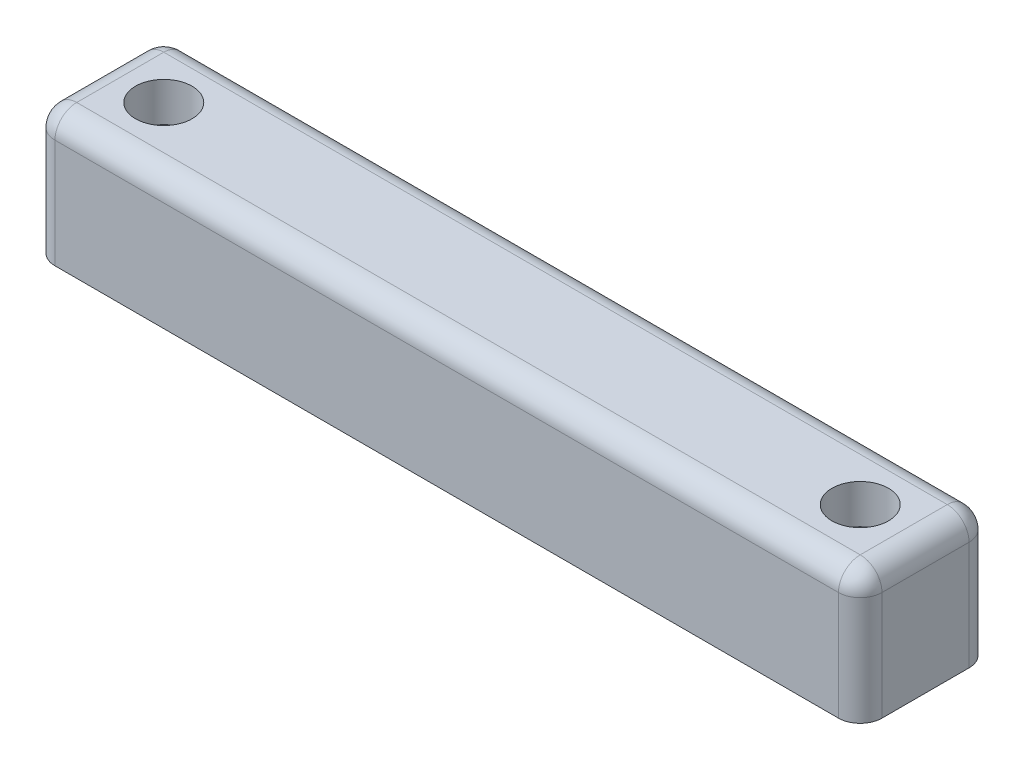
ISO-10303-21;
HEADER;
FILE_DESCRIPTION(('STEP AP214'),'2;1');
FILE_NAME('part.step','',(''),(''),'','','');
FILE_SCHEMA(('AUTOMOTIVE_DESIGN { 1 0 10303 214 1 1 1 1 }'));
ENDSEC;
DATA;
#1=APPLICATION_CONTEXT('core data for automotive mechanical design processes');
#2=APPLICATION_PROTOCOL_DEFINITION('international standard','automotive_design',2000,#1);
#3=PRODUCT_CONTEXT('',#1,'mechanical');
#4=PRODUCT('Part','Part','',(#3));
#5=PRODUCT_RELATED_PRODUCT_CATEGORY('part','',(#4));
#6=PRODUCT_DEFINITION_FORMATION('','',#4);
#7=PRODUCT_DEFINITION_CONTEXT('part definition',#1,'design');
#8=PRODUCT_DEFINITION('design','',#6,#7);
#9=PRODUCT_DEFINITION_SHAPE('','',#8);
#10=(LENGTH_UNIT() NAMED_UNIT(*) SI_UNIT(.MILLI.,.METRE.));
#11=(NAMED_UNIT(*) PLANE_ANGLE_UNIT() SI_UNIT($,.RADIAN.));
#12=(NAMED_UNIT(*) SI_UNIT($,.STERADIAN.) SOLID_ANGLE_UNIT());
#13=UNCERTAINTY_MEASURE_WITH_UNIT(LENGTH_MEASURE(1.E-05),#10,'distance_accuracy_value','');
#14=(GEOMETRIC_REPRESENTATION_CONTEXT(3) GLOBAL_UNCERTAINTY_ASSIGNED_CONTEXT((#13)) GLOBAL_UNIT_ASSIGNED_CONTEXT((#10,
#11,#12)) REPRESENTATION_CONTEXT('',''));
#15=CARTESIAN_POINT('',(0.,0.,0.));
#16=DIRECTION('',(0.,0.,1.));
#17=DIRECTION('',(1.,0.,0.));
#18=AXIS2_PLACEMENT_3D('',#15,#16,#17);
#19=CARTESIAN_POINT('',(-95.,-15.,15.));
#20=DIRECTION('',(1.,0.,0.));
#21=DIRECTION('',(0.,0.,-1.));
#22=AXIS2_PLACEMENT_3D('',#19,#20,#21);
#23=PLANE('',#22);
#24=DIRECTION('',(0.,0.,-1.));
#25=VECTOR('',#24,1.);
#26=CARTESIAN_POINT('',(-95.,9.99999999999999,15.));
#27=LINE('',#26,#25);
#28=CARTESIAN_POINT('',(-95.,9.99999999999999,10.));
#29=VERTEX_POINT('',#28);
#30=CARTESIAN_POINT('',(-95.,9.99999999999999,-10.));
#31=VERTEX_POINT('',#30);
#32=EDGE_CURVE('E213',#29,#31,#27,.T.);
#33=ORIENTED_EDGE('',*,*,#32,.T.);
#34=DIRECTION('',(0.,-1.,0.));
#35=VECTOR('',#34,1.);
#36=CARTESIAN_POINT('',(-95.,-15.,-10.));
#37=LINE('',#36,#35);
#38=CARTESIAN_POINT('',(-95.,-15.,-10.));
#39=VERTEX_POINT('',#38);
#40=EDGE_CURVE('E216',#31,#39,#37,.T.);
#41=ORIENTED_EDGE('',*,*,#40,.T.);
#42=DIRECTION('',(0.,0.,-1.));
#43=VECTOR('',#42,1.);
#44=CARTESIAN_POINT('',(-95.,-15.,15.));
#45=LINE('',#44,#43);
#46=CARTESIAN_POINT('',(-95.,-15.,10.));
#47=VERTEX_POINT('',#46);
#48=EDGE_CURVE('E179',#47,#39,#45,.T.);
#49=ORIENTED_EDGE('',*,*,#48,.F.);
#50=DIRECTION('',(0.,-1.,0.));
#51=VECTOR('',#50,1.);
#52=CARTESIAN_POINT('',(-95.,15.,10.));
#53=LINE('',#52,#51);
#54=EDGE_CURVE('E210',#47,#29,#53,.F.);
#55=ORIENTED_EDGE('',*,*,#54,.T.);
#56=EDGE_LOOP('',(#33,#41,#49,#55));
#57=FACE_BOUND('',#56,.T.);
#58=ADVANCED_FACE('F56',(#57),#23,.F.);
#59=CARTESIAN_POINT('',(95.,-15.,15.));
#60=DIRECTION('',(0.,1.,0.));
#61=DIRECTION('',(-1.,0.,0.));
#62=AXIS2_PLACEMENT_3D('',#59,#60,#61);
#63=PLANE('',#62);
#64=CARTESIAN_POINT('',(-80.,-15.,0.));
#65=DIRECTION('',(0.,1.,0.));
#66=DIRECTION('',(0.,0.,1.));
#67=AXIS2_PLACEMENT_3D('',#64,#65,#66);
#68=CIRCLE('',#67,3.3);
#69=CARTESIAN_POINT('',(-80.,-15.,3.3));
#70=VERTEX_POINT('',#69);
#71=EDGE_CURVE('E572',#70,#70,#68,.T.);
#72=ORIENTED_EDGE('',*,*,#71,.T.);
#73=EDGE_LOOP('',(#72));
#74=FACE_BOUND('',#73,.T.);
#75=CARTESIAN_POINT('',(80.,-15.,0.));
#76=DIRECTION('',(0.,1.,0.));
#77=DIRECTION('',(0.,0.,1.));
#78=AXIS2_PLACEMENT_3D('',#75,#76,#77);
#79=CIRCLE('',#78,3.3);
#80=CARTESIAN_POINT('',(80.,-15.,3.3));
#81=VERTEX_POINT('',#80);
#82=EDGE_CURVE('E158',#81,#81,#79,.T.);
#83=ORIENTED_EDGE('',*,*,#82,.T.);
#84=EDGE_LOOP('',(#83));
#85=FACE_BOUND('',#84,.T.);
#86=ORIENTED_EDGE('',*,*,#48,.T.);
#87=CARTESIAN_POINT('',(-90.,-15.,-10.));
#88=DIRECTION('',(0.,1.,0.));
#89=DIRECTION('',(-1.,0.,0.));
#90=AXIS2_PLACEMENT_3D('',#87,#88,#89);
#91=CIRCLE('',#90,5.);
#92=CARTESIAN_POINT('',(-90.,-15.,-15.));
#93=VERTEX_POINT('',#92);
#94=EDGE_CURVE('E13',#39,#93,#91,.F.);
#95=ORIENTED_EDGE('',*,*,#94,.T.);
#96=DIRECTION('',(1.,0.,0.));
#97=VECTOR('',#96,1.);
#98=CARTESIAN_POINT('',(95.,-15.,-15.));
#99=LINE('',#98,#97);
#100=CARTESIAN_POINT('',(90.,-15.,-15.));
#101=VERTEX_POINT('',#100);
#102=EDGE_CURVE('E265',#93,#101,#99,.T.);
#103=ORIENTED_EDGE('',*,*,#102,.T.);
#104=CARTESIAN_POINT('',(90.,-15.,-10.));
#105=DIRECTION('',(0.,1.,0.));
#106=DIRECTION('',(-1.,0.,0.));
#107=AXIS2_PLACEMENT_3D('',#104,#105,#106);
#108=CIRCLE('',#107,5.);
#109=CARTESIAN_POINT('',(95.,-15.,-10.));
#110=VERTEX_POINT('',#109);
#111=EDGE_CURVE('E229',#101,#110,#108,.F.);
#112=ORIENTED_EDGE('',*,*,#111,.T.);
#113=DIRECTION('',(0.,0.,-1.));
#114=VECTOR('',#113,1.);
#115=CARTESIAN_POINT('',(95.,-15.,15.));
#116=LINE('',#115,#114);
#117=CARTESIAN_POINT('',(95.,-15.,10.));
#118=VERTEX_POINT('',#117);
#119=EDGE_CURVE('E277',#118,#110,#116,.T.);
#120=ORIENTED_EDGE('',*,*,#119,.F.);
#121=CARTESIAN_POINT('',(90.,-15.,10.));
#122=DIRECTION('',(0.,1.,0.));
#123=DIRECTION('',(-1.,0.,0.));
#124=AXIS2_PLACEMENT_3D('',#121,#122,#123);
#125=CIRCLE('',#124,5.);
#126=CARTESIAN_POINT('',(90.,-15.,15.));
#127=VERTEX_POINT('',#126);
#128=EDGE_CURVE('E226',#118,#127,#125,.F.);
#129=ORIENTED_EDGE('',*,*,#128,.T.);
#130=DIRECTION('',(1.,0.,0.));
#131=VECTOR('',#130,1.);
#132=CARTESIAN_POINT('',(95.,-15.,15.));
#133=LINE('',#132,#131);
#134=CARTESIAN_POINT('',(-90.,-15.,15.));
#135=VERTEX_POINT('',#134);
#136=EDGE_CURVE('E270',#135,#127,#133,.T.);
#137=ORIENTED_EDGE('',*,*,#136,.F.);
#138=CARTESIAN_POINT('',(-90.,-15.,10.));
#139=DIRECTION('',(0.,1.,0.));
#140=DIRECTION('',(-1.,0.,0.));
#141=AXIS2_PLACEMENT_3D('',#138,#139,#140);
#142=CIRCLE('',#141,5.);
#143=EDGE_CURVE('E66',#135,#47,#142,.F.);
#144=ORIENTED_EDGE('',*,*,#143,.T.);
#145=EDGE_LOOP('',(#86,#95,#103,#112,#120,#129,#137,#144));
#146=FACE_BOUND('',#145,.T.);
#147=ADVANCED_FACE('F326',(#74,#85,#146),#63,.F.);
#148=CARTESIAN_POINT('',(95.,-15.,15.));
#149=DIRECTION('',(-1.,0.,0.));
#150=DIRECTION('',(0.,0.,1.));
#151=AXIS2_PLACEMENT_3D('',#148,#149,#150);
#152=PLANE('',#151);
#153=ORIENTED_EDGE('',*,*,#119,.T.);
#154=DIRECTION('',(0.,1.,0.));
#155=VECTOR('',#154,1.);
#156=CARTESIAN_POINT('',(95.,-15.,-10.));
#157=LINE('',#156,#155);
#158=CARTESIAN_POINT('',(95.,10.,-10.));
#159=VERTEX_POINT('',#158);
#160=EDGE_CURVE('E198',#110,#159,#157,.T.);
#161=ORIENTED_EDGE('',*,*,#160,.T.);
#162=DIRECTION('',(0.,0.,-1.));
#163=VECTOR('',#162,1.);
#164=CARTESIAN_POINT('',(95.,10.,15.));
#165=LINE('',#164,#163);
#166=CARTESIAN_POINT('',(95.,10.,10.));
#167=VERTEX_POINT('',#166);
#168=EDGE_CURVE('E153',#159,#167,#165,.F.);
#169=ORIENTED_EDGE('',*,*,#168,.T.);
#170=DIRECTION('',(0.,1.,0.));
#171=VECTOR('',#170,1.);
#172=CARTESIAN_POINT('',(95.,-15.,10.));
#173=LINE('',#172,#171);
#174=EDGE_CURVE('E186',#167,#118,#173,.F.);
#175=ORIENTED_EDGE('',*,*,#174,.T.);
#176=EDGE_LOOP('',(#153,#161,#169,#175));
#177=FACE_BOUND('',#176,.T.);
#178=ADVANCED_FACE('F306',(#177),#152,.F.);
#179=CARTESIAN_POINT('',(95.,15.,15.));
#180=DIRECTION('',(0.,-1.,0.));
#181=DIRECTION('',(1.,0.,0.));
#182=AXIS2_PLACEMENT_3D('',#179,#180,#181);
#183=PLANE('',#182);
#184=CARTESIAN_POINT('',(-80.,15.,0.));
#185=DIRECTION('',(0.,1.,0.));
#186=DIRECTION('',(0.,0.,1.));
#187=AXIS2_PLACEMENT_3D('',#184,#185,#186);
#188=CIRCLE('',#187,6.50000000000001);
#189=CARTESIAN_POINT('',(-80.,15.,6.50000000000001));
#190=VERTEX_POINT('',#189);
#191=EDGE_CURVE('E565',#190,#190,#188,.T.);
#192=ORIENTED_EDGE('',*,*,#191,.F.);
#193=EDGE_LOOP('',(#192));
#194=FACE_BOUND('',#193,.T.);
#195=CARTESIAN_POINT('',(80.,15.,0.));
#196=DIRECTION('',(0.,1.,0.));
#197=DIRECTION('',(0.,0.,1.));
#198=AXIS2_PLACEMENT_3D('',#195,#196,#197);
#199=CIRCLE('',#198,6.50000000000001);
#200=CARTESIAN_POINT('',(80.,15.,6.50000000000001));
#201=VERTEX_POINT('',#200);
#202=EDGE_CURVE('E568',#201,#201,#199,.T.);
#203=ORIENTED_EDGE('',*,*,#202,.F.);
#204=EDGE_LOOP('',(#203));
#205=FACE_BOUND('',#204,.T.);
#206=DIRECTION('',(-1.,0.,0.));
#207=VECTOR('',#206,1.);
#208=CARTESIAN_POINT('',(95.,15.,10.));
#209=LINE('',#208,#207);
#210=CARTESIAN_POINT('',(-90.,15.,10.));
#211=VERTEX_POINT('',#210);
#212=CARTESIAN_POINT('',(90.,15.,10.));
#213=VERTEX_POINT('',#212);
#214=EDGE_CURVE('E183',#211,#213,#209,.F.);
#215=ORIENTED_EDGE('',*,*,#214,.T.);
#216=DIRECTION('',(0.,0.,-1.));
#217=VECTOR('',#216,1.);
#218=CARTESIAN_POINT('',(90.,15.,15.));
#219=LINE('',#218,#217);
#220=CARTESIAN_POINT('',(90.,15.,-10.));
#221=VERTEX_POINT('',#220);
#222=EDGE_CURVE('E151',#213,#221,#219,.T.);
#223=ORIENTED_EDGE('',*,*,#222,.T.);
#224=DIRECTION('',(-1.,0.,0.));
#225=VECTOR('',#224,1.);
#226=CARTESIAN_POINT('',(95.,15.,-10.));
#227=LINE('',#226,#225);
#228=CARTESIAN_POINT('',(-90.,15.,-10.));
#229=VERTEX_POINT('',#228);
#230=EDGE_CURVE('E171',#221,#229,#227,.T.);
#231=ORIENTED_EDGE('',*,*,#230,.T.);
#232=DIRECTION('',(0.,0.,-1.));
#233=VECTOR('',#232,1.);
#234=CARTESIAN_POINT('',(-90.,15.,15.));
#235=LINE('',#234,#233);
#236=EDGE_CURVE('E178',#229,#211,#235,.F.);
#237=ORIENTED_EDGE('',*,*,#236,.T.);
#238=EDGE_LOOP('',(#215,#223,#231,#237));
#239=FACE_BOUND('',#238,.T.);
#240=ADVANCED_FACE('F181',(#194,#205,#239),#183,.F.);
#241=CARTESIAN_POINT('',(0.,0.,15.));
#242=DIRECTION('',(0.,0.,1.));
#243=DIRECTION('',(1.,0.,0.));
#244=AXIS2_PLACEMENT_3D('',#241,#242,#243);
#245=PLANE('',#244);
#246=DIRECTION('',(-1.,0.,0.));
#247=VECTOR('',#246,1.);
#248=CARTESIAN_POINT('',(-95.,9.99999999999998,15.));
#249=LINE('',#248,#247);
#250=CARTESIAN_POINT('',(90.,10.,15.));
#251=VERTEX_POINT('',#250);
#252=CARTESIAN_POINT('',(-90.,9.99999999999998,15.));
#253=VERTEX_POINT('',#252);
#254=EDGE_CURVE('E204',#251,#253,#249,.T.);
#255=ORIENTED_EDGE('',*,*,#254,.T.);
#256=DIRECTION('',(0.,-1.,0.));
#257=VECTOR('',#256,1.);
#258=CARTESIAN_POINT('',(-90.,-15.,15.));
#259=LINE('',#258,#257);
#260=EDGE_CURVE('E207',#253,#135,#259,.T.);
#261=ORIENTED_EDGE('',*,*,#260,.T.);
#262=ORIENTED_EDGE('',*,*,#136,.T.);
#263=DIRECTION('',(0.,1.,0.));
#264=VECTOR('',#263,1.);
#265=CARTESIAN_POINT('',(90.,15.,15.));
#266=LINE('',#265,#264);
#267=EDGE_CURVE('E201',#127,#251,#266,.T.);
#268=ORIENTED_EDGE('',*,*,#267,.T.);
#269=EDGE_LOOP('',(#255,#261,#262,#268));
#270=FACE_BOUND('',#269,.T.);
#271=ADVANCED_FACE('F440',(#270),#245,.T.);
#272=CARTESIAN_POINT('',(0.,0.,-15.));
#273=DIRECTION('',(0.,0.,1.));
#274=DIRECTION('',(1.,0.,0.));
#275=AXIS2_PLACEMENT_3D('',#272,#273,#274);
#276=PLANE('',#275);
#277=ORIENTED_EDGE('',*,*,#102,.F.);
#278=DIRECTION('',(0.,-1.,0.));
#279=VECTOR('',#278,1.);
#280=CARTESIAN_POINT('',(-90.,0.,-15.));
#281=LINE('',#280,#279);
#282=CARTESIAN_POINT('',(-90.,9.99999999999999,-15.));
#283=VERTEX_POINT('',#282);
#284=EDGE_CURVE('E74',#93,#283,#281,.F.);
#285=ORIENTED_EDGE('',*,*,#284,.T.);
#286=DIRECTION('',(-1.,0.,0.));
#287=VECTOR('',#286,1.);
#288=CARTESIAN_POINT('',(0.,10.,-15.));
#289=LINE('',#288,#287);
#290=CARTESIAN_POINT('',(90.,10.,-15.));
#291=VERTEX_POINT('',#290);
#292=EDGE_CURVE('E82',#283,#291,#289,.F.);
#293=ORIENTED_EDGE('',*,*,#292,.T.);
#294=DIRECTION('',(0.,1.,0.));
#295=VECTOR('',#294,1.);
#296=CARTESIAN_POINT('',(90.,0.,-15.));
#297=LINE('',#296,#295);
#298=EDGE_CURVE('E219',#291,#101,#297,.F.);
#299=ORIENTED_EDGE('',*,*,#298,.T.);
#300=EDGE_LOOP('',(#277,#285,#293,#299));
#301=FACE_BOUND('',#300,.T.);
#302=ADVANCED_FACE('F310',(#301),#276,.F.);
#303=CARTESIAN_POINT('',(-90.,0.,10.));
#304=DIRECTION('',(0.,1.,0.));
#305=DIRECTION('',(0.,0.,1.));
#306=AXIS2_PLACEMENT_3D('',#303,#304,#305);
#307=CYLINDRICAL_SURFACE('',#306,5.);
#308=ORIENTED_EDGE('',*,*,#143,.F.);
#309=ORIENTED_EDGE('',*,*,#260,.F.);
#310=CARTESIAN_POINT('',(-90.,9.99999999999999,10.));
#311=DIRECTION('',(0.,1.,0.));
#312=DIRECTION('',(0.,0.,1.));
#313=AXIS2_PLACEMENT_3D('',#310,#311,#312);
#314=CIRCLE('',#313,5.);
#315=EDGE_CURVE('E60',#29,#253,#314,.T.);
#316=ORIENTED_EDGE('',*,*,#315,.F.);
#317=ORIENTED_EDGE('',*,*,#54,.F.);
#318=EDGE_LOOP('',(#308,#309,#316,#317));
#319=FACE_BOUND('',#318,.T.);
#320=ADVANCED_FACE('F58',(#319),#307,.T.);
#321=CARTESIAN_POINT('',(-90.,9.99999999999999,15.));
#322=DIRECTION('',(0.,0.,-1.));
#323=DIRECTION('',(-1.,0.,0.));
#324=AXIS2_PLACEMENT_3D('',#321,#322,#323);
#325=CYLINDRICAL_SURFACE('',#324,5.);
#326=CARTESIAN_POINT('',(-90.,9.99999999999999,-10.));
#327=DIRECTION('',(0.,0.,-1.));
#328=DIRECTION('',(-1.,0.,0.));
#329=AXIS2_PLACEMENT_3D('',#326,#327,#328);
#330=CIRCLE('',#329,5.);
#331=EDGE_CURVE('E254',#31,#229,#330,.T.);
#332=ORIENTED_EDGE('',*,*,#331,.F.);
#333=ORIENTED_EDGE('',*,*,#32,.F.);
#334=CARTESIAN_POINT('',(-90.,9.99999999999999,10.));
#335=DIRECTION('',(0.,0.,1.));
#336=DIRECTION('',(1.,0.,0.));
#337=AXIS2_PLACEMENT_3D('',#334,#335,#336);
#338=CIRCLE('',#337,5.);
#339=EDGE_CURVE('E257',#211,#29,#338,.T.);
#340=ORIENTED_EDGE('',*,*,#339,.F.);
#341=ORIENTED_EDGE('',*,*,#236,.F.);
#342=EDGE_LOOP('',(#332,#333,#340,#341));
#343=FACE_BOUND('',#342,.T.);
#344=ADVANCED_FACE('F290',(#343),#325,.T.);
#345=CARTESIAN_POINT('',(-90.,-15.,-10.));
#346=DIRECTION('',(0.,-1.,0.));
#347=DIRECTION('',(0.,0.,-1.));
#348=AXIS2_PLACEMENT_3D('',#345,#346,#347);
#349=CYLINDRICAL_SURFACE('',#348,5.);
#350=ORIENTED_EDGE('',*,*,#94,.F.);
#351=ORIENTED_EDGE('',*,*,#40,.F.);
#352=CARTESIAN_POINT('',(-90.,9.99999999999999,-10.));
#353=DIRECTION('',(0.,1.,0.));
#354=DIRECTION('',(0.,0.,1.));
#355=AXIS2_PLACEMENT_3D('',#352,#353,#354);
#356=CIRCLE('',#355,5.);
#357=EDGE_CURVE('E250',#283,#31,#356,.T.);
#358=ORIENTED_EDGE('',*,*,#357,.F.);
#359=ORIENTED_EDGE('',*,*,#284,.F.);
#360=EDGE_LOOP('',(#350,#351,#358,#359));
#361=FACE_BOUND('',#360,.T.);
#362=ADVANCED_FACE('F313',(#361),#349,.T.);
#363=CARTESIAN_POINT('',(-90.,9.99999999999999,10.));
#364=DIRECTION('',(0.,0.,1.));
#365=DIRECTION('',(1.,0.,0.));
#366=AXIS2_PLACEMENT_3D('',#363,#364,#365);
#367=SPHERICAL_SURFACE('',#366,5.);
#368=ORIENTED_EDGE('',*,*,#339,.T.);
#369=ORIENTED_EDGE('',*,*,#315,.T.);
#370=CARTESIAN_POINT('',(-90.,9.99999999999998,10.));
#371=DIRECTION('',(-1.,0.,0.));
#372=DIRECTION('',(0.,0.,1.));
#373=AXIS2_PLACEMENT_3D('',#370,#371,#372);
#374=CIRCLE('',#373,5.);
#375=EDGE_CURVE('E246',#211,#253,#374,.F.);
#376=ORIENTED_EDGE('',*,*,#375,.F.);
#377=EDGE_LOOP('',(#368,#369,#376));
#378=FACE_BOUND('',#377,.T.);
#379=ADVANCED_FACE('F291',(#378),#367,.T.);
#380=CARTESIAN_POINT('',(-90.,9.99999999999999,-10.));
#381=DIRECTION('',(0.,0.,1.));
#382=DIRECTION('',(1.,0.,0.));
#383=AXIS2_PLACEMENT_3D('',#380,#381,#382);
#384=SPHERICAL_SURFACE('',#383,5.);
#385=ORIENTED_EDGE('',*,*,#357,.T.);
#386=ORIENTED_EDGE('',*,*,#331,.T.);
#387=CARTESIAN_POINT('',(-90.,9.99999999999999,-10.));
#388=DIRECTION('',(-1.,0.,0.));
#389=DIRECTION('',(0.,0.,1.));
#390=AXIS2_PLACEMENT_3D('',#387,#388,#389);
#391=CIRCLE('',#390,5.);
#392=EDGE_CURVE('E174',#283,#229,#391,.F.);
#393=ORIENTED_EDGE('',*,*,#392,.F.);
#394=EDGE_LOOP('',(#385,#386,#393));
#395=FACE_BOUND('',#394,.T.);
#396=ADVANCED_FACE('F316',(#395),#384,.T.);
#397=CARTESIAN_POINT('',(90.,0.,10.));
#398=DIRECTION('',(0.,-1.,0.));
#399=DIRECTION('',(0.,0.,-1.));
#400=AXIS2_PLACEMENT_3D('',#397,#398,#399);
#401=CYLINDRICAL_SURFACE('',#400,5.);
#402=ORIENTED_EDGE('',*,*,#128,.F.);
#403=ORIENTED_EDGE('',*,*,#174,.F.);
#404=CARTESIAN_POINT('',(90.,10.,10.));
#405=DIRECTION('',(0.,1.,0.));
#406=DIRECTION('',(-1.,0.,0.));
#407=AXIS2_PLACEMENT_3D('',#404,#405,#406);
#408=CIRCLE('',#407,5.);
#409=EDGE_CURVE('E241',#251,#167,#408,.T.);
#410=ORIENTED_EDGE('',*,*,#409,.F.);
#411=ORIENTED_EDGE('',*,*,#267,.F.);
#412=EDGE_LOOP('',(#402,#403,#410,#411));
#413=FACE_BOUND('',#412,.T.);
#414=ADVANCED_FACE('F303',(#413),#401,.T.);
#415=CARTESIAN_POINT('',(0.,10.,10.));
#416=DIRECTION('',(1.,0.,0.));
#417=DIRECTION('',(0.,1.,0.));
#418=AXIS2_PLACEMENT_3D('',#415,#416,#417);
#419=CYLINDRICAL_SURFACE('',#418,5.);
#420=ORIENTED_EDGE('',*,*,#375,.T.);
#421=ORIENTED_EDGE('',*,*,#254,.F.);
#422=CARTESIAN_POINT('',(90.,10.,10.));
#423=DIRECTION('',(1.,0.,0.));
#424=DIRECTION('',(0.,0.,-1.));
#425=AXIS2_PLACEMENT_3D('',#422,#423,#424);
#426=CIRCLE('',#425,5.);
#427=EDGE_CURVE('E168',#213,#251,#426,.T.);
#428=ORIENTED_EDGE('',*,*,#427,.F.);
#429=ORIENTED_EDGE('',*,*,#214,.F.);
#430=EDGE_LOOP('',(#420,#421,#428,#429));
#431=FACE_BOUND('',#430,.T.);
#432=ADVANCED_FACE('F294',(#431),#419,.T.);
#433=CARTESIAN_POINT('',(95.,10.,-10.));
#434=DIRECTION('',(-1.,0.,0.));
#435=DIRECTION('',(0.,-1.,0.));
#436=AXIS2_PLACEMENT_3D('',#433,#434,#435);
#437=CYLINDRICAL_SURFACE('',#436,5.);
#438=ORIENTED_EDGE('',*,*,#392,.T.);
#439=ORIENTED_EDGE('',*,*,#230,.F.);
#440=CARTESIAN_POINT('',(90.,10.,-10.));
#441=DIRECTION('',(1.,0.,0.));
#442=DIRECTION('',(0.,0.,-1.));
#443=AXIS2_PLACEMENT_3D('',#440,#441,#442);
#444=CIRCLE('',#443,5.);
#445=EDGE_CURVE('E161',#291,#221,#444,.T.);
#446=ORIENTED_EDGE('',*,*,#445,.F.);
#447=ORIENTED_EDGE('',*,*,#292,.F.);
#448=EDGE_LOOP('',(#438,#439,#446,#447));
#449=FACE_BOUND('',#448,.T.);
#450=ADVANCED_FACE('F172',(#449),#437,.T.);
#451=CARTESIAN_POINT('',(90.,-15.,-10.));
#452=DIRECTION('',(0.,1.,0.));
#453=DIRECTION('',(0.,0.,1.));
#454=AXIS2_PLACEMENT_3D('',#451,#452,#453);
#455=CYLINDRICAL_SURFACE('',#454,5.);
#456=ORIENTED_EDGE('',*,*,#111,.F.);
#457=ORIENTED_EDGE('',*,*,#298,.F.);
#458=CARTESIAN_POINT('',(90.,10.,-10.));
#459=DIRECTION('',(0.,1.,0.));
#460=DIRECTION('',(0.,0.,1.));
#461=AXIS2_PLACEMENT_3D('',#458,#459,#460);
#462=CIRCLE('',#461,5.);
#463=EDGE_CURVE('E165',#159,#291,#462,.T.);
#464=ORIENTED_EDGE('',*,*,#463,.F.);
#465=ORIENTED_EDGE('',*,*,#160,.F.);
#466=EDGE_LOOP('',(#456,#457,#464,#465));
#467=FACE_BOUND('',#466,.T.);
#468=ADVANCED_FACE('F309',(#467),#455,.T.);
#469=CARTESIAN_POINT('',(90.,10.,10.));
#470=DIRECTION('',(0.,0.,1.));
#471=DIRECTION('',(1.,0.,0.));
#472=AXIS2_PLACEMENT_3D('',#469,#470,#471);
#473=SPHERICAL_SURFACE('',#472,5.);
#474=ORIENTED_EDGE('',*,*,#427,.T.);
#475=ORIENTED_EDGE('',*,*,#409,.T.);
#476=CARTESIAN_POINT('',(90.,10.,10.));
#477=DIRECTION('',(0.,0.,1.));
#478=DIRECTION('',(1.,0.,0.));
#479=AXIS2_PLACEMENT_3D('',#476,#477,#478);
#480=CIRCLE('',#479,5.);
#481=EDGE_CURVE('E157',#213,#167,#480,.F.);
#482=ORIENTED_EDGE('',*,*,#481,.F.);
#483=EDGE_LOOP('',(#474,#475,#482));
#484=FACE_BOUND('',#483,.T.);
#485=ADVANCED_FACE('F298',(#484),#473,.T.);
#486=CARTESIAN_POINT('',(90.,10.,-10.));
#487=DIRECTION('',(0.,0.,1.));
#488=DIRECTION('',(1.,0.,0.));
#489=AXIS2_PLACEMENT_3D('',#486,#487,#488);
#490=SPHERICAL_SURFACE('',#489,5.);
#491=ORIENTED_EDGE('',*,*,#463,.T.);
#492=ORIENTED_EDGE('',*,*,#445,.T.);
#493=CARTESIAN_POINT('',(90.,10.,-10.));
#494=DIRECTION('',(0.,0.,-1.));
#495=DIRECTION('',(-1.,0.,0.));
#496=AXIS2_PLACEMENT_3D('',#493,#494,#495);
#497=CIRCLE('',#496,5.);
#498=EDGE_CURVE('E147',#159,#221,#497,.F.);
#499=ORIENTED_EDGE('',*,*,#498,.F.);
#500=EDGE_LOOP('',(#491,#492,#499));
#501=FACE_BOUND('',#500,.T.);
#502=ADVANCED_FACE('F163',(#501),#490,.T.);
#503=CARTESIAN_POINT('',(90.,10.,15.));
#504=DIRECTION('',(0.,0.,-1.));
#505=DIRECTION('',(-1.,0.,0.));
#506=AXIS2_PLACEMENT_3D('',#503,#504,#505);
#507=CYLINDRICAL_SURFACE('',#506,5.);
#508=ORIENTED_EDGE('',*,*,#481,.T.);
#509=ORIENTED_EDGE('',*,*,#168,.F.);
#510=ORIENTED_EDGE('',*,*,#498,.T.);
#511=ORIENTED_EDGE('',*,*,#222,.F.);
#512=EDGE_LOOP('',(#508,#509,#510,#511));
#513=FACE_BOUND('',#512,.T.);
#514=ADVANCED_FACE('F149',(#513),#507,.T.);
#515=CARTESIAN_POINT('',(80.,15.,0.));
#516=DIRECTION('',(0.,1.,0.));
#517=DIRECTION('',(0.,0.,1.));
#518=AXIS2_PLACEMENT_3D('',#515,#516,#517);
#519=CYLINDRICAL_SURFACE('',#518,3.3);
#520=ORIENTED_EDGE('',*,*,#82,.F.);
#521=EDGE_LOOP('',(#520));
#522=FACE_BOUND('',#521,.T.);
#523=CARTESIAN_POINT('',(80.,6.00000000000001,0.));
#524=DIRECTION('',(0.,1.,0.));
#525=DIRECTION('',(0.,0.,1.));
#526=AXIS2_PLACEMENT_3D('',#523,#524,#525);
#527=CIRCLE('',#526,3.3);
#528=CARTESIAN_POINT('',(80.,6.00000000000001,3.3));
#529=VERTEX_POINT('',#528);
#530=EDGE_CURVE('E577',#529,#529,#527,.T.);
#531=ORIENTED_EDGE('',*,*,#530,.T.);
#532=EDGE_LOOP('',(#531));
#533=FACE_BOUND('',#532,.T.);
#534=ADVANCED_FACE('F338',(#522,#533),#519,.F.);
#535=CARTESIAN_POINT('',(83.3,6.00000000000001,0.));
#536=DIRECTION('',(0.,-1.,0.));
#537=DIRECTION('',(0.,0.,-1.));
#538=AXIS2_PLACEMENT_3D('',#535,#536,#537);
#539=PLANE('',#538);
#540=ORIENTED_EDGE('',*,*,#530,.F.);
#541=EDGE_LOOP('',(#540));
#542=FACE_BOUND('',#541,.T.);
#543=CARTESIAN_POINT('',(80.,6.00000000000001,0.));
#544=DIRECTION('',(0.,1.,0.));
#545=DIRECTION('',(0.,0.,1.));
#546=AXIS2_PLACEMENT_3D('',#543,#544,#545);
#547=CIRCLE('',#546,6.49999999999999);
#548=CARTESIAN_POINT('',(80.,6.00000000000001,6.49999999999999));
#549=VERTEX_POINT('',#548);
#550=EDGE_CURVE('E571',#549,#549,#547,.T.);
#551=ORIENTED_EDGE('',*,*,#550,.T.);
#552=EDGE_LOOP('',(#551));
#553=FACE_BOUND('',#552,.T.);
#554=ADVANCED_FACE('F372',(#542,#553),#539,.F.);
#555=CARTESIAN_POINT('',(80.,15.,0.));
#556=DIRECTION('',(0.,1.,0.));
#557=DIRECTION('',(0.,0.,1.));
#558=AXIS2_PLACEMENT_3D('',#555,#556,#557);
#559=CYLINDRICAL_SURFACE('',#558,6.5);
#560=ORIENTED_EDGE('',*,*,#550,.F.);
#561=EDGE_LOOP('',(#560));
#562=FACE_BOUND('',#561,.T.);
#563=ORIENTED_EDGE('',*,*,#202,.T.);
#564=EDGE_LOOP('',(#563));
#565=FACE_BOUND('',#564,.T.);
#566=ADVANCED_FACE('F379',(#562,#565),#559,.F.);
#567=CARTESIAN_POINT('',(-80.,15.,0.));
#568=DIRECTION('',(0.,1.,0.));
#569=DIRECTION('',(0.,0.,1.));
#570=AXIS2_PLACEMENT_3D('',#567,#568,#569);
#571=CYLINDRICAL_SURFACE('',#570,3.3);
#572=ORIENTED_EDGE('',*,*,#71,.F.);
#573=EDGE_LOOP('',(#572));
#574=FACE_BOUND('',#573,.T.);
#575=CARTESIAN_POINT('',(-80.,5.99999999999999,0.));
#576=DIRECTION('',(0.,1.,0.));
#577=DIRECTION('',(0.,0.,1.));
#578=AXIS2_PLACEMENT_3D('',#575,#576,#577);
#579=CIRCLE('',#578,3.3);
#580=CARTESIAN_POINT('',(-80.,5.99999999999999,3.3));
#581=VERTEX_POINT('',#580);
#582=EDGE_CURVE('E581',#581,#581,#579,.T.);
#583=ORIENTED_EDGE('',*,*,#582,.T.);
#584=EDGE_LOOP('',(#583));
#585=FACE_BOUND('',#584,.T.);
#586=ADVANCED_FACE('F386',(#574,#585),#571,.F.);
#587=CARTESIAN_POINT('',(-76.7,5.99999999999999,0.));
#588=DIRECTION('',(0.,-1.,0.));
#589=DIRECTION('',(0.,0.,-1.));
#590=AXIS2_PLACEMENT_3D('',#587,#588,#589);
#591=PLANE('',#590);
#592=ORIENTED_EDGE('',*,*,#582,.F.);
#593=EDGE_LOOP('',(#592));
#594=FACE_BOUND('',#593,.T.);
#595=CARTESIAN_POINT('',(-80.,5.99999999999999,0.));
#596=DIRECTION('',(0.,1.,0.));
#597=DIRECTION('',(0.,0.,1.));
#598=AXIS2_PLACEMENT_3D('',#595,#596,#597);
#599=CIRCLE('',#598,6.49999999999999);
#600=CARTESIAN_POINT('',(-80.,5.99999999999999,6.49999999999999));
#601=VERTEX_POINT('',#600);
#602=EDGE_CURVE('E614',#601,#601,#599,.T.);
#603=ORIENTED_EDGE('',*,*,#602,.T.);
#604=EDGE_LOOP('',(#603));
#605=FACE_BOUND('',#604,.T.);
#606=ADVANCED_FACE('F393',(#594,#605),#591,.F.);
#607=CARTESIAN_POINT('',(-80.,15.,0.));
#608=DIRECTION('',(0.,1.,0.));
#609=DIRECTION('',(0.,0.,1.));
#610=AXIS2_PLACEMENT_3D('',#607,#608,#609);
#611=CYLINDRICAL_SURFACE('',#610,6.5);
#612=ORIENTED_EDGE('',*,*,#602,.F.);
#613=EDGE_LOOP('',(#612));
#614=FACE_BOUND('',#613,.T.);
#615=ORIENTED_EDGE('',*,*,#191,.T.);
#616=EDGE_LOOP('',(#615));
#617=FACE_BOUND('',#616,.T.);
#618=ADVANCED_FACE('F400',(#614,#617),#611,.F.);
#619=CLOSED_SHELL('',(#58,#147,#178,#240,#271,#302,#320,#344,#362,#379,#396,#414,#432,#450,#468,
#485,#502,#514,#534,#554,#566,#586,#606,#618));
#620=MANIFOLD_SOLID_BREP('B2',#619);
#621=ADVANCED_BREP_SHAPE_REPRESENTATION('',(#18,#620),#14);
#622=SHAPE_DEFINITION_REPRESENTATION(#9,#621);
ENDSEC;
END-ISO-10303-21;
